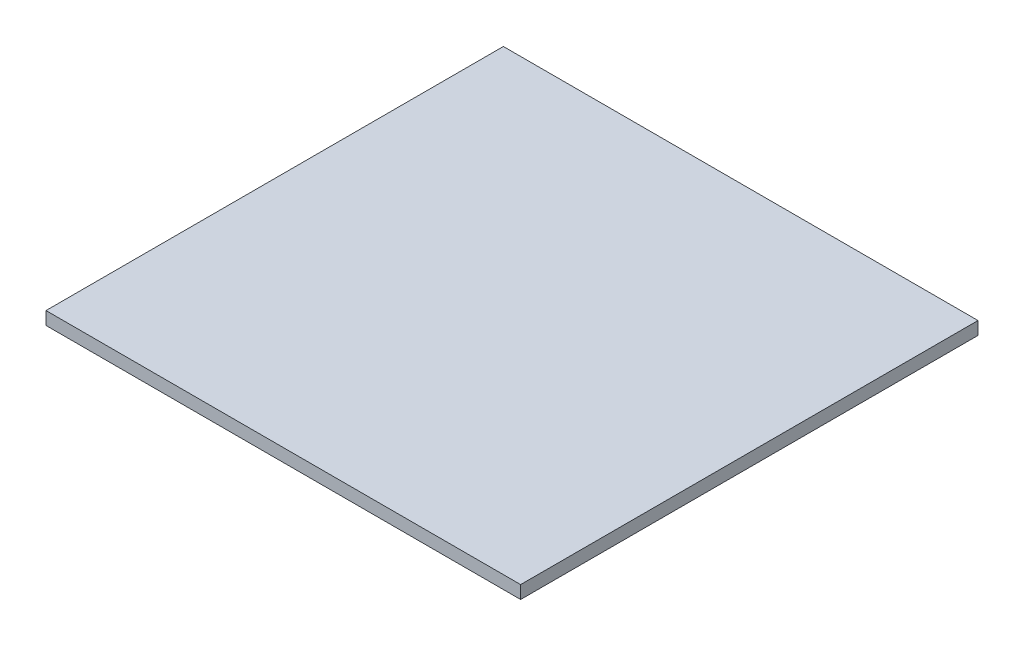
ISO-10303-21;
HEADER;
FILE_DESCRIPTION(('STEP AP214'),'2;1');
FILE_NAME('part.step','',(''),(''),'','','');
FILE_SCHEMA(('AUTOMOTIVE_DESIGN { 1 0 10303 214 1 1 1 1 }'));
ENDSEC;
DATA;
#1=APPLICATION_CONTEXT('core data for automotive mechanical design processes');
#2=APPLICATION_PROTOCOL_DEFINITION('international standard','automotive_design',2000,#1);
#3=PRODUCT_CONTEXT('',#1,'mechanical');
#4=PRODUCT('Part','Part','',(#3));
#5=PRODUCT_RELATED_PRODUCT_CATEGORY('part','',(#4));
#6=PRODUCT_DEFINITION_FORMATION('','',#4);
#7=PRODUCT_DEFINITION_CONTEXT('part definition',#1,'design');
#8=PRODUCT_DEFINITION('design','',#6,#7);
#9=PRODUCT_DEFINITION_SHAPE('','',#8);
#10=(LENGTH_UNIT() NAMED_UNIT(*) SI_UNIT(.MILLI.,.METRE.));
#11=(NAMED_UNIT(*) PLANE_ANGLE_UNIT() SI_UNIT($,.RADIAN.));
#12=(NAMED_UNIT(*) SI_UNIT($,.STERADIAN.) SOLID_ANGLE_UNIT());
#13=UNCERTAINTY_MEASURE_WITH_UNIT(LENGTH_MEASURE(1.E-05),#10,'distance_accuracy_value','');
#14=(GEOMETRIC_REPRESENTATION_CONTEXT(3) GLOBAL_UNCERTAINTY_ASSIGNED_CONTEXT((#13)) GLOBAL_UNIT_ASSIGNED_CONTEXT((#10,
#11,#12)) REPRESENTATION_CONTEXT('',''));
#15=CARTESIAN_POINT('',(0.,0.,0.));
#16=DIRECTION('',(0.,0.,1.));
#17=DIRECTION('',(1.,0.,0.));
#18=AXIS2_PLACEMENT_3D('',#15,#16,#17);
#19=CARTESIAN_POINT('',(27.5,1.5,26.5));
#20=DIRECTION('',(0.,0.,1.));
#21=DIRECTION('',(1.,0.,0.));
#22=AXIS2_PLACEMENT_3D('',#19,#20,#21);
#23=PLANE('',#22);
#24=DIRECTION('',(-1.,0.,0.));
#25=VECTOR('',#24,1.);
#26=CARTESIAN_POINT('',(27.5,0.,26.5));
#27=LINE('',#26,#25);
#28=CARTESIAN_POINT('',(27.5,0.,26.5));
#29=VERTEX_POINT('',#28);
#30=CARTESIAN_POINT('',(-27.5,0.,26.5));
#31=VERTEX_POINT('',#30);
#32=EDGE_CURVE('E110',#29,#31,#27,.T.);
#33=ORIENTED_EDGE('',*,*,#32,.F.);
#34=DIRECTION('',(0.,-1.,0.));
#35=VECTOR('',#34,1.);
#36=CARTESIAN_POINT('',(27.5,1.5,26.5));
#37=LINE('',#36,#35);
#38=CARTESIAN_POINT('',(27.5,1.5,26.5));
#39=VERTEX_POINT('',#38);
#40=EDGE_CURVE('E11',#39,#29,#37,.T.);
#41=ORIENTED_EDGE('',*,*,#40,.F.);
#42=DIRECTION('',(-1.,0.,0.));
#43=VECTOR('',#42,1.);
#44=CARTESIAN_POINT('',(27.5,1.5,26.5));
#45=LINE('',#44,#43);
#46=CARTESIAN_POINT('',(-27.5,1.5,26.5));
#47=VERTEX_POINT('',#46);
#48=EDGE_CURVE('E103',#39,#47,#45,.T.);
#49=ORIENTED_EDGE('',*,*,#48,.T.);
#50=DIRECTION('',(0.,-1.,0.));
#51=VECTOR('',#50,1.);
#52=CARTESIAN_POINT('',(-27.5,1.5,26.5));
#53=LINE('',#52,#51);
#54=EDGE_CURVE('E42',#47,#31,#53,.T.);
#55=ORIENTED_EDGE('',*,*,#54,.T.);
#56=EDGE_LOOP('',(#33,#41,#49,#55));
#57=FACE_BOUND('',#56,.T.);
#58=ADVANCED_FACE('F39',(#57),#23,.T.);
#59=CARTESIAN_POINT('',(27.5,1.5,26.5));
#60=DIRECTION('',(-1.,0.,0.));
#61=DIRECTION('',(0.,0.,1.));
#62=AXIS2_PLACEMENT_3D('',#59,#60,#61);
#63=PLANE('',#62);
#64=DIRECTION('',(0.,0.,-1.));
#65=VECTOR('',#64,1.);
#66=CARTESIAN_POINT('',(27.5,0.,26.5));
#67=LINE('',#66,#65);
#68=CARTESIAN_POINT('',(27.5,0.,-26.5));
#69=VERTEX_POINT('',#68);
#70=EDGE_CURVE('E73',#29,#69,#67,.T.);
#71=ORIENTED_EDGE('',*,*,#70,.T.);
#72=DIRECTION('',(0.,-1.,0.));
#73=VECTOR('',#72,1.);
#74=CARTESIAN_POINT('',(27.5,1.5,-26.5));
#75=LINE('',#74,#73);
#76=CARTESIAN_POINT('',(27.5,1.5,-26.5));
#77=VERTEX_POINT('',#76);
#78=EDGE_CURVE('E49',#77,#69,#75,.T.);
#79=ORIENTED_EDGE('',*,*,#78,.F.);
#80=DIRECTION('',(0.,0.,-1.));
#81=VECTOR('',#80,1.);
#82=CARTESIAN_POINT('',(27.5,1.5,26.5));
#83=LINE('',#82,#81);
#84=EDGE_CURVE('E90',#39,#77,#83,.T.);
#85=ORIENTED_EDGE('',*,*,#84,.F.);
#86=ORIENTED_EDGE('',*,*,#40,.T.);
#87=EDGE_LOOP('',(#71,#79,#85,#86));
#88=FACE_BOUND('',#87,.T.);
#89=ADVANCED_FACE('F126',(#88),#63,.F.);
#90=CARTESIAN_POINT('',(27.5,1.5,-26.5));
#91=DIRECTION('',(0.,0.,1.));
#92=DIRECTION('',(1.,0.,0.));
#93=AXIS2_PLACEMENT_3D('',#90,#91,#92);
#94=PLANE('',#93);
#95=DIRECTION('',(-1.,0.,0.));
#96=VECTOR('',#95,1.);
#97=CARTESIAN_POINT('',(27.5,0.,-26.5));
#98=LINE('',#97,#96);
#99=CARTESIAN_POINT('',(-27.5,0.,-26.5));
#100=VERTEX_POINT('',#99);
#101=EDGE_CURVE('E98',#69,#100,#98,.T.);
#102=ORIENTED_EDGE('',*,*,#101,.T.);
#103=DIRECTION('',(0.,-1.,0.));
#104=VECTOR('',#103,1.);
#105=CARTESIAN_POINT('',(-27.5,1.5,-26.5));
#106=LINE('',#105,#104);
#107=CARTESIAN_POINT('',(-27.5,1.5,-26.5));
#108=VERTEX_POINT('',#107);
#109=EDGE_CURVE('E95',#108,#100,#106,.T.);
#110=ORIENTED_EDGE('',*,*,#109,.F.);
#111=DIRECTION('',(-1.,0.,0.));
#112=VECTOR('',#111,1.);
#113=CARTESIAN_POINT('',(27.5,1.5,-26.5));
#114=LINE('',#113,#112);
#115=EDGE_CURVE('E85',#77,#108,#114,.T.);
#116=ORIENTED_EDGE('',*,*,#115,.F.);
#117=ORIENTED_EDGE('',*,*,#78,.T.);
#118=EDGE_LOOP('',(#102,#110,#116,#117));
#119=FACE_BOUND('',#118,.T.);
#120=ADVANCED_FACE('F96',(#119),#94,.F.);
#121=CARTESIAN_POINT('',(-27.5,1.5,26.5));
#122=DIRECTION('',(-1.,0.,0.));
#123=DIRECTION('',(0.,0.,1.));
#124=AXIS2_PLACEMENT_3D('',#121,#122,#123);
#125=PLANE('',#124);
#126=DIRECTION('',(0.,0.,-1.));
#127=VECTOR('',#126,1.);
#128=CARTESIAN_POINT('',(-27.5,0.,26.5));
#129=LINE('',#128,#127);
#130=EDGE_CURVE('E114',#31,#100,#129,.T.);
#131=ORIENTED_EDGE('',*,*,#130,.F.);
#132=ORIENTED_EDGE('',*,*,#54,.F.);
#133=DIRECTION('',(0.,0.,-1.));
#134=VECTOR('',#133,1.);
#135=CARTESIAN_POINT('',(-27.5,1.5,26.5));
#136=LINE('',#135,#134);
#137=EDGE_CURVE('E89',#47,#108,#136,.T.);
#138=ORIENTED_EDGE('',*,*,#137,.T.);
#139=ORIENTED_EDGE('',*,*,#109,.T.);
#140=EDGE_LOOP('',(#131,#132,#138,#139));
#141=FACE_BOUND('',#140,.T.);
#142=ADVANCED_FACE('F101',(#141),#125,.T.);
#143=CARTESIAN_POINT('',(0.,1.5,0.));
#144=DIRECTION('',(0.,-1.,0.));
#145=DIRECTION('',(0.,0.,-1.));
#146=AXIS2_PLACEMENT_3D('',#143,#144,#145);
#147=PLANE('',#146);
#148=ORIENTED_EDGE('',*,*,#48,.F.);
#149=ORIENTED_EDGE('',*,*,#84,.T.);
#150=ORIENTED_EDGE('',*,*,#115,.T.);
#151=ORIENTED_EDGE('',*,*,#137,.F.);
#152=EDGE_LOOP('',(#148,#149,#150,#151));
#153=FACE_BOUND('',#152,.T.);
#154=ADVANCED_FACE('F88',(#153),#147,.F.);
#155=CARTESIAN_POINT('',(0.,0.,0.));
#156=DIRECTION('',(0.,-1.,0.));
#157=DIRECTION('',(0.,0.,-1.));
#158=AXIS2_PLACEMENT_3D('',#155,#156,#157);
#159=PLANE('',#158);
#160=ORIENTED_EDGE('',*,*,#32,.T.);
#161=ORIENTED_EDGE('',*,*,#130,.T.);
#162=ORIENTED_EDGE('',*,*,#101,.F.);
#163=ORIENTED_EDGE('',*,*,#70,.F.);
#164=EDGE_LOOP('',(#160,#161,#162,#163));
#165=FACE_BOUND('',#164,.T.);
#166=ADVANCED_FACE('F123',(#165),#159,.T.);
#167=CLOSED_SHELL('',(#58,#89,#120,#142,#154,#166));
#168=MANIFOLD_SOLID_BREP('B2',#167);
#169=ADVANCED_BREP_SHAPE_REPRESENTATION('',(#18,#168),#14);
#170=SHAPE_DEFINITION_REPRESENTATION(#9,#169);
ENDSEC;
END-ISO-10303-21;
